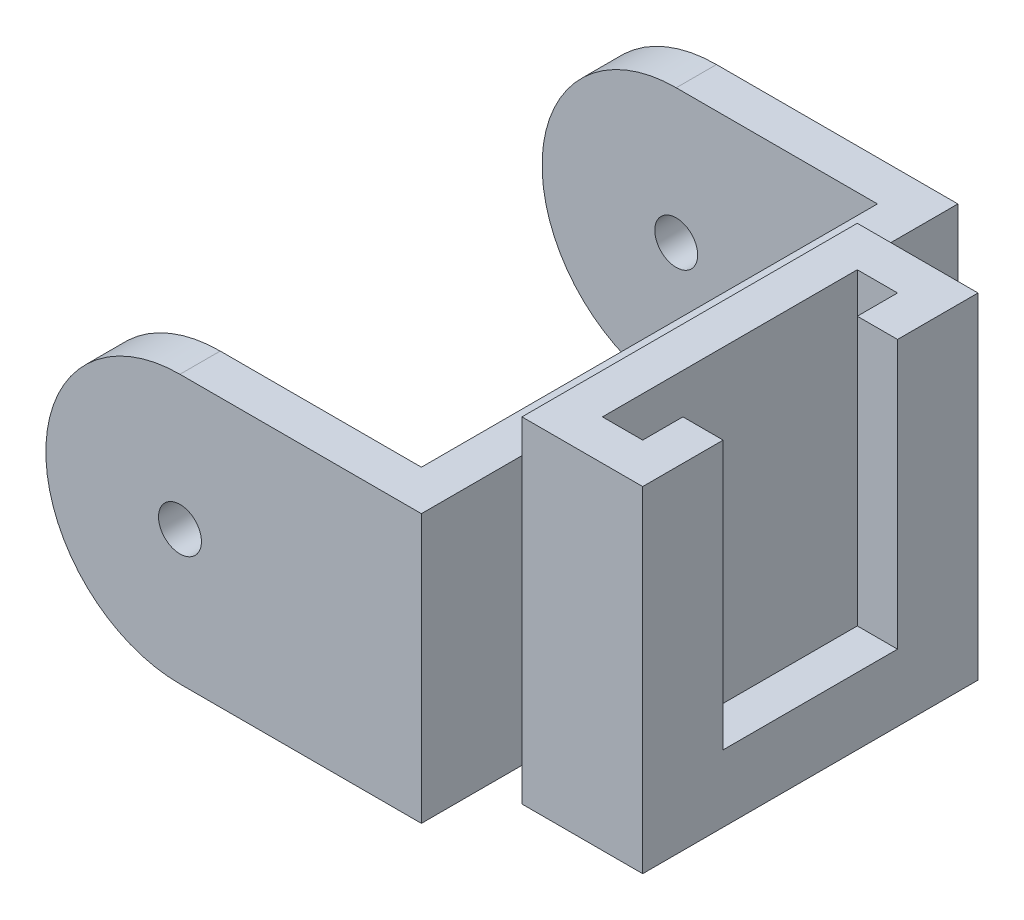
ISO-10303-21;
HEADER;
FILE_DESCRIPTION(('STEP AP214'),'2;1');
FILE_NAME('part.step','',(''),(''),'','','');
FILE_SCHEMA(('AUTOMOTIVE_DESIGN { 1 0 10303 214 1 1 1 1 }'));
ENDSEC;
DATA;
#1=APPLICATION_CONTEXT('core data for automotive mechanical design processes');
#2=APPLICATION_PROTOCOL_DEFINITION('international standard','automotive_design',2000,#1);
#3=PRODUCT_CONTEXT('',#1,'mechanical');
#4=PRODUCT('Part','Part','',(#3));
#5=PRODUCT_RELATED_PRODUCT_CATEGORY('part','',(#4));
#6=PRODUCT_DEFINITION_FORMATION('','',#4);
#7=PRODUCT_DEFINITION_CONTEXT('part definition',#1,'design');
#8=PRODUCT_DEFINITION('design','',#6,#7);
#9=PRODUCT_DEFINITION_SHAPE('','',#8);
#10=(LENGTH_UNIT() NAMED_UNIT(*) SI_UNIT(.MILLI.,.METRE.));
#11=(NAMED_UNIT(*) PLANE_ANGLE_UNIT() SI_UNIT($,.RADIAN.));
#12=(NAMED_UNIT(*) SI_UNIT($,.STERADIAN.) SOLID_ANGLE_UNIT());
#13=UNCERTAINTY_MEASURE_WITH_UNIT(LENGTH_MEASURE(1.E-05),#10,'distance_accuracy_value','');
#14=(GEOMETRIC_REPRESENTATION_CONTEXT(3) GLOBAL_UNCERTAINTY_ASSIGNED_CONTEXT((#13)) GLOBAL_UNIT_ASSIGNED_CONTEXT((#10,
#11,#12)) REPRESENTATION_CONTEXT('',''));
#15=CARTESIAN_POINT('',(0.,0.,0.));
#16=DIRECTION('',(0.,0.,1.));
#17=DIRECTION('',(1.,0.,0.));
#18=AXIS2_PLACEMENT_3D('',#15,#16,#17);
#19=CARTESIAN_POINT('',(3.,0.,0.));
#20=DIRECTION('',(1.,0.,0.));
#21=DIRECTION('',(0.,0.,-1.));
#22=AXIS2_PLACEMENT_3D('',#19,#20,#21);
#23=PLANE('',#22);
#24=DIRECTION('',(0.,1.,0.));
#25=VECTOR('',#24,1.);
#26=CARTESIAN_POINT('',(3.,12.5,-12.5));
#27=LINE('',#26,#25);
#28=CARTESIAN_POINT('',(3.,-10.,-12.5));
#29=VERTEX_POINT('',#28);
#30=CARTESIAN_POINT('',(3.,10.,-12.5));
#31=VERTEX_POINT('',#30);
#32=EDGE_CURVE('E11',#29,#31,#27,.T.);
#33=ORIENTED_EDGE('',*,*,#32,.F.);
#34=DIRECTION('',(0.,0.,-1.));
#35=VECTOR('',#34,1.);
#36=CARTESIAN_POINT('',(3.,-10.,20.));
#37=LINE('',#36,#35);
#38=CARTESIAN_POINT('',(3.,-10.,-20.));
#39=VERTEX_POINT('',#38);
#40=EDGE_CURVE('E368',#29,#39,#37,.T.);
#41=ORIENTED_EDGE('',*,*,#40,.T.);
#42=DIRECTION('',(0.,1.,0.));
#43=VECTOR('',#42,1.);
#44=CARTESIAN_POINT('',(3.,10.,-20.));
#45=LINE('',#44,#43);
#46=CARTESIAN_POINT('',(3.,10.,-20.));
#47=VERTEX_POINT('',#46);
#48=EDGE_CURVE('E354',#39,#47,#45,.T.);
#49=ORIENTED_EDGE('',*,*,#48,.T.);
#50=DIRECTION('',(0.,0.,1.));
#51=VECTOR('',#50,1.);
#52=CARTESIAN_POINT('',(3.,10.,20.));
#53=LINE('',#52,#51);
#54=EDGE_CURVE('E360',#47,#31,#53,.T.);
#55=ORIENTED_EDGE('',*,*,#54,.T.);
#56=EDGE_LOOP('',(#33,#41,#49,#55));
#57=FACE_BOUND('',#56,.T.);
#58=ADVANCED_FACE('F45',(#57),#23,.T.);
#59=CARTESIAN_POINT('',(3.,10.,-20.));
#60=DIRECTION('',(0.,0.,1.));
#61=DIRECTION('',(0.,-1.,0.));
#62=AXIS2_PLACEMENT_3D('',#59,#60,#61);
#63=PLANE('',#62);
#64=CARTESIAN_POINT('',(-15.,0.,-20.));
#65=DIRECTION('',(0.,0.,1.));
#66=DIRECTION('',(0.,-1.,0.));
#67=AXIS2_PLACEMENT_3D('',#64,#65,#66);
#68=CIRCLE('',#67,1.6);
#69=CARTESIAN_POINT('',(-15.,-1.6,-20.));
#70=VERTEX_POINT('',#69);
#71=EDGE_CURVE('E307',#70,#70,#68,.T.);
#72=ORIENTED_EDGE('',*,*,#71,.T.);
#73=EDGE_LOOP('',(#72));
#74=FACE_BOUND('',#73,.T.);
#75=DIRECTION('',(-1.,0.,0.));
#76=VECTOR('',#75,1.);
#77=CARTESIAN_POINT('',(3.,-10.,-20.));
#78=LINE('',#77,#76);
#79=CARTESIAN_POINT('',(-15.,-10.,-20.));
#80=VERTEX_POINT('',#79);
#81=EDGE_CURVE('E372',#39,#80,#78,.T.);
#82=ORIENTED_EDGE('',*,*,#81,.T.);
#83=CARTESIAN_POINT('',(-15.,0.,-20.));
#84=DIRECTION('',(0.,0.,1.));
#85=DIRECTION('',(0.,-1.,0.));
#86=AXIS2_PLACEMENT_3D('',#83,#84,#85);
#87=CIRCLE('',#86,10.);
#88=CARTESIAN_POINT('',(-15.,10.,-20.));
#89=VERTEX_POINT('',#88);
#90=EDGE_CURVE('E330',#89,#80,#87,.T.);
#91=ORIENTED_EDGE('',*,*,#90,.F.);
#92=DIRECTION('',(-1.,0.,0.));
#93=VECTOR('',#92,1.);
#94=CARTESIAN_POINT('',(3.,10.,-20.));
#95=LINE('',#94,#93);
#96=EDGE_CURVE('E390',#47,#89,#95,.T.);
#97=ORIENTED_EDGE('',*,*,#96,.F.);
#98=ORIENTED_EDGE('',*,*,#48,.F.);
#99=EDGE_LOOP('',(#82,#91,#97,#98));
#100=FACE_BOUND('',#99,.T.);
#101=ADVANCED_FACE('F47',(#74,#100),#63,.F.);
#102=CARTESIAN_POINT('',(3.,10.,20.));
#103=DIRECTION('',(0.,0.,-1.));
#104=DIRECTION('',(0.,1.,0.));
#105=AXIS2_PLACEMENT_3D('',#102,#103,#104);
#106=PLANE('',#105);
#107=CARTESIAN_POINT('',(-15.,0.,20.));
#108=DIRECTION('',(0.,0.,1.));
#109=DIRECTION('',(1.,0.,0.));
#110=AXIS2_PLACEMENT_3D('',#107,#108,#109);
#111=CIRCLE('',#110,1.6);
#112=CARTESIAN_POINT('',(-13.4,0.,20.));
#113=VERTEX_POINT('',#112);
#114=EDGE_CURVE('E299',#113,#113,#111,.T.);
#115=ORIENTED_EDGE('',*,*,#114,.F.);
#116=EDGE_LOOP('',(#115));
#117=FACE_BOUND('',#116,.T.);
#118=CARTESIAN_POINT('',(-15.,0.,20.));
#119=DIRECTION('',(0.,0.,1.));
#120=DIRECTION('',(1.,0.,0.));
#121=AXIS2_PLACEMENT_3D('',#118,#119,#120);
#122=CIRCLE('',#121,10.);
#123=CARTESIAN_POINT('',(-15.,10.,20.));
#124=VERTEX_POINT('',#123);
#125=CARTESIAN_POINT('',(-15.,-10.,20.));
#126=VERTEX_POINT('',#125);
#127=EDGE_CURVE('E316',#124,#126,#122,.T.);
#128=ORIENTED_EDGE('',*,*,#127,.T.);
#129=DIRECTION('',(-1.,0.,0.));
#130=VECTOR('',#129,1.);
#131=CARTESIAN_POINT('',(3.,-10.,20.));
#132=LINE('',#131,#130);
#133=CARTESIAN_POINT('',(3.,-10.,20.));
#134=VERTEX_POINT('',#133);
#135=EDGE_CURVE('E383',#134,#126,#132,.T.);
#136=ORIENTED_EDGE('',*,*,#135,.F.);
#137=DIRECTION('',(0.,-1.,0.));
#138=VECTOR('',#137,1.);
#139=CARTESIAN_POINT('',(3.,10.,20.));
#140=LINE('',#139,#138);
#141=CARTESIAN_POINT('',(3.,10.,20.));
#142=VERTEX_POINT('',#141);
#143=EDGE_CURVE('E364',#142,#134,#140,.T.);
#144=ORIENTED_EDGE('',*,*,#143,.F.);
#145=DIRECTION('',(-1.,0.,0.));
#146=VECTOR('',#145,1.);
#147=CARTESIAN_POINT('',(3.,10.,20.));
#148=LINE('',#147,#146);
#149=EDGE_CURVE('E387',#142,#124,#148,.T.);
#150=ORIENTED_EDGE('',*,*,#149,.T.);
#151=EDGE_LOOP('',(#128,#136,#144,#150));
#152=FACE_BOUND('',#151,.T.);
#153=ADVANCED_FACE('F438',(#117,#152),#106,.F.);
#154=CARTESIAN_POINT('',(-25.,10.,-17.));
#155=DIRECTION('',(0.,0.,-1.));
#156=DIRECTION('',(-1.,0.,0.));
#157=AXIS2_PLACEMENT_3D('',#154,#155,#156);
#158=PLANE('',#157);
#159=CARTESIAN_POINT('',(-15.,0.,-17.));
#160=DIRECTION('',(0.,0.,-1.));
#161=DIRECTION('',(-1.,0.,0.));
#162=AXIS2_PLACEMENT_3D('',#159,#160,#161);
#163=CIRCLE('',#162,1.6);
#164=CARTESIAN_POINT('',(-16.6,0.,-17.));
#165=VERTEX_POINT('',#164);
#166=EDGE_CURVE('E303',#165,#165,#163,.T.);
#167=ORIENTED_EDGE('',*,*,#166,.T.);
#168=EDGE_LOOP('',(#167));
#169=FACE_BOUND('',#168,.T.);
#170=CARTESIAN_POINT('',(-15.,0.,-17.));
#171=DIRECTION('',(0.,0.,-1.));
#172=DIRECTION('',(-1.,0.,0.));
#173=AXIS2_PLACEMENT_3D('',#170,#171,#172);
#174=CIRCLE('',#173,10.);
#175=CARTESIAN_POINT('',(-15.,-10.,-17.));
#176=VERTEX_POINT('',#175);
#177=CARTESIAN_POINT('',(-15.,10.,-17.));
#178=VERTEX_POINT('',#177);
#179=EDGE_CURVE('E327',#176,#178,#174,.T.);
#180=ORIENTED_EDGE('',*,*,#179,.F.);
#181=DIRECTION('',(1.,0.,0.));
#182=VECTOR('',#181,1.);
#183=CARTESIAN_POINT('',(-25.,-10.,-17.));
#184=LINE('',#183,#182);
#185=CARTESIAN_POINT('',(0.,-10.,-17.));
#186=VERTEX_POINT('',#185);
#187=EDGE_CURVE('E350',#176,#186,#184,.T.);
#188=ORIENTED_EDGE('',*,*,#187,.T.);
#189=DIRECTION('',(0.,1.,0.));
#190=VECTOR('',#189,1.);
#191=CARTESIAN_POINT('',(0.,10.,-17.));
#192=LINE('',#191,#190);
#193=CARTESIAN_POINT('',(0.,10.,-17.));
#194=VERTEX_POINT('',#193);
#195=EDGE_CURVE('E343',#186,#194,#192,.T.);
#196=ORIENTED_EDGE('',*,*,#195,.T.);
#197=DIRECTION('',(1.,0.,0.));
#198=VECTOR('',#197,1.);
#199=CARTESIAN_POINT('',(-25.,10.,-17.));
#200=LINE('',#199,#198);
#201=EDGE_CURVE('E347',#178,#194,#200,.T.);
#202=ORIENTED_EDGE('',*,*,#201,.F.);
#203=EDGE_LOOP('',(#180,#188,#196,#202));
#204=FACE_BOUND('',#203,.T.);
#205=ADVANCED_FACE('F502',(#169,#204),#158,.F.);
#206=CARTESIAN_POINT('',(-25.,10.,17.));
#207=DIRECTION('',(0.,0.,1.));
#208=DIRECTION('',(0.,-1.,0.));
#209=AXIS2_PLACEMENT_3D('',#206,#207,#208);
#210=PLANE('',#209);
#211=CARTESIAN_POINT('',(-15.,0.,17.));
#212=DIRECTION('',(0.,0.,1.));
#213=DIRECTION('',(0.,-1.,0.));
#214=AXIS2_PLACEMENT_3D('',#211,#212,#213);
#215=CIRCLE('',#214,1.6);
#216=CARTESIAN_POINT('',(-15.,-1.6,17.));
#217=VERTEX_POINT('',#216);
#218=EDGE_CURVE('E49',#217,#217,#215,.T.);
#219=ORIENTED_EDGE('',*,*,#218,.T.);
#220=EDGE_LOOP('',(#219));
#221=FACE_BOUND('',#220,.T.);
#222=DIRECTION('',(1.,0.,0.));
#223=VECTOR('',#222,1.);
#224=CARTESIAN_POINT('',(-25.,-10.,17.));
#225=LINE('',#224,#223);
#226=CARTESIAN_POINT('',(-15.,-10.,17.));
#227=VERTEX_POINT('',#226);
#228=CARTESIAN_POINT('',(0.,-10.,17.));
#229=VERTEX_POINT('',#228);
#230=EDGE_CURVE('E336',#227,#229,#225,.T.);
#231=ORIENTED_EDGE('',*,*,#230,.F.);
#232=CARTESIAN_POINT('',(-15.,0.,17.));
#233=DIRECTION('',(0.,0.,1.));
#234=DIRECTION('',(0.,-1.,0.));
#235=AXIS2_PLACEMENT_3D('',#232,#233,#234);
#236=CIRCLE('',#235,10.);
#237=CARTESIAN_POINT('',(-15.,10.,17.));
#238=VERTEX_POINT('',#237);
#239=EDGE_CURVE('E324',#238,#227,#236,.T.);
#240=ORIENTED_EDGE('',*,*,#239,.F.);
#241=DIRECTION('',(1.,0.,0.));
#242=VECTOR('',#241,1.);
#243=CARTESIAN_POINT('',(-25.,10.,17.));
#244=LINE('',#243,#242);
#245=CARTESIAN_POINT('',(0.,10.,17.));
#246=VERTEX_POINT('',#245);
#247=EDGE_CURVE('E333',#238,#246,#244,.T.);
#248=ORIENTED_EDGE('',*,*,#247,.T.);
#249=DIRECTION('',(0.,-1.,0.));
#250=VECTOR('',#249,1.);
#251=CARTESIAN_POINT('',(0.,10.,17.));
#252=LINE('',#251,#250);
#253=EDGE_CURVE('E339',#246,#229,#252,.T.);
#254=ORIENTED_EDGE('',*,*,#253,.T.);
#255=EDGE_LOOP('',(#231,#240,#248,#254));
#256=FACE_BOUND('',#255,.T.);
#257=ADVANCED_FACE('F464',(#221,#256),#210,.F.);
#258=CARTESIAN_POINT('',(3.,-10.,20.));
#259=DIRECTION('',(0.,1.,0.));
#260=DIRECTION('',(0.,0.,1.));
#261=AXIS2_PLACEMENT_3D('',#258,#259,#260);
#262=PLANE('',#261);
#263=DIRECTION('',(0.,0.,1.));
#264=VECTOR('',#263,1.);
#265=CARTESIAN_POINT('',(-15.,-10.,-28.));
#266=LINE('',#265,#264);
#267=EDGE_CURVE('E315',#80,#176,#266,.T.);
#268=ORIENTED_EDGE('',*,*,#267,.F.);
#269=ORIENTED_EDGE('',*,*,#81,.F.);
#270=ORIENTED_EDGE('',*,*,#40,.F.);
#271=CARTESIAN_POINT('',(3.,-10.,12.5));
#272=VERTEX_POINT('',#271);
#273=EDGE_CURVE('E373',#272,#29,#37,.T.);
#274=ORIENTED_EDGE('',*,*,#273,.F.);
#275=EDGE_CURVE('E369',#134,#272,#37,.T.);
#276=ORIENTED_EDGE('',*,*,#275,.F.);
#277=ORIENTED_EDGE('',*,*,#135,.T.);
#278=EDGE_CURVE('E311',#227,#126,#266,.T.);
#279=ORIENTED_EDGE('',*,*,#278,.F.);
#280=ORIENTED_EDGE('',*,*,#230,.T.);
#281=DIRECTION('',(0.,0.,-1.));
#282=VECTOR('',#281,1.);
#283=CARTESIAN_POINT('',(0.,-10.,20.));
#284=LINE('',#283,#282);
#285=EDGE_CURVE('E359',#229,#186,#284,.T.);
#286=ORIENTED_EDGE('',*,*,#285,.T.);
#287=ORIENTED_EDGE('',*,*,#187,.F.);
#288=EDGE_LOOP('',(#268,#269,#270,#274,#276,#277,#279,#280,#286,#287));
#289=FACE_BOUND('',#288,.T.);
#290=ADVANCED_FACE('F443',(#289),#262,.F.);
#291=CARTESIAN_POINT('',(0.,0.,0.));
#292=DIRECTION('',(1.,0.,0.));
#293=DIRECTION('',(0.,0.,-1.));
#294=AXIS2_PLACEMENT_3D('',#291,#292,#293);
#295=PLANE('',#294);
#296=ORIENTED_EDGE('',*,*,#253,.F.);
#297=DIRECTION('',(0.,0.,1.));
#298=VECTOR('',#297,1.);
#299=CARTESIAN_POINT('',(0.,10.,20.));
#300=LINE('',#299,#298);
#301=EDGE_CURVE('E353',#194,#246,#300,.T.);
#302=ORIENTED_EDGE('',*,*,#301,.F.);
#303=ORIENTED_EDGE('',*,*,#195,.F.);
#304=ORIENTED_EDGE('',*,*,#285,.F.);
#305=EDGE_LOOP('',(#296,#302,#303,#304));
#306=FACE_BOUND('',#305,.T.);
#307=ADVANCED_FACE('F494',(#306),#295,.F.);
#308=CARTESIAN_POINT('',(3.,10.,20.));
#309=DIRECTION('',(0.,-1.,0.));
#310=DIRECTION('',(0.,0.,-1.));
#311=AXIS2_PLACEMENT_3D('',#308,#309,#310);
#312=PLANE('',#311);
#313=ORIENTED_EDGE('',*,*,#96,.T.);
#314=DIRECTION('',(0.,0.,1.));
#315=VECTOR('',#314,1.);
#316=CARTESIAN_POINT('',(-15.,10.,-28.));
#317=LINE('',#316,#315);
#318=EDGE_CURVE('E323',#89,#178,#317,.T.);
#319=ORIENTED_EDGE('',*,*,#318,.T.);
#320=ORIENTED_EDGE('',*,*,#201,.T.);
#321=ORIENTED_EDGE('',*,*,#301,.T.);
#322=ORIENTED_EDGE('',*,*,#247,.F.);
#323=EDGE_CURVE('E319',#238,#124,#317,.T.);
#324=ORIENTED_EDGE('',*,*,#323,.T.);
#325=ORIENTED_EDGE('',*,*,#149,.F.);
#326=CARTESIAN_POINT('',(3.,10.,12.5));
#327=VERTEX_POINT('',#326);
#328=EDGE_CURVE('E358',#327,#142,#53,.T.);
#329=ORIENTED_EDGE('',*,*,#328,.F.);
#330=EDGE_CURVE('E365',#31,#327,#53,.T.);
#331=ORIENTED_EDGE('',*,*,#330,.F.);
#332=ORIENTED_EDGE('',*,*,#54,.F.);
#333=EDGE_LOOP('',(#313,#319,#320,#321,#322,#324,#325,#329,#331,#332));
#334=FACE_BOUND('',#333,.T.);
#335=ADVANCED_FACE('F435',(#334),#312,.F.);
#336=DIRECTION('',(0.,-1.,0.));
#337=VECTOR('',#336,1.);
#338=CARTESIAN_POINT('',(3.,12.5,12.5));
#339=LINE('',#338,#337);
#340=EDGE_CURVE('E55',#327,#272,#339,.T.);
#341=ORIENTED_EDGE('',*,*,#340,.F.);
#342=ORIENTED_EDGE('',*,*,#328,.T.);
#343=ORIENTED_EDGE('',*,*,#143,.T.);
#344=ORIENTED_EDGE('',*,*,#275,.T.);
#345=EDGE_LOOP('',(#341,#342,#343,#344));
#346=FACE_BOUND('',#345,.T.);
#347=ADVANCED_FACE('F432',(#346),#23,.T.);
#348=CARTESIAN_POINT('',(-15.,0.,-28.));
#349=DIRECTION('',(0.,0.,1.));
#350=DIRECTION('',(1.,0.,0.));
#351=AXIS2_PLACEMENT_3D('',#348,#349,#350);
#352=CYLINDRICAL_SURFACE('',#351,10.);
#353=ORIENTED_EDGE('',*,*,#239,.T.);
#354=ORIENTED_EDGE('',*,*,#278,.T.);
#355=ORIENTED_EDGE('',*,*,#127,.F.);
#356=ORIENTED_EDGE('',*,*,#323,.F.);
#357=EDGE_LOOP('',(#353,#354,#355,#356));
#358=FACE_BOUND('',#357,.T.);
#359=ADVANCED_FACE('F477',(#358),#352,.T.);
#360=ORIENTED_EDGE('',*,*,#90,.T.);
#361=ORIENTED_EDGE('',*,*,#267,.T.);
#362=ORIENTED_EDGE('',*,*,#179,.T.);
#363=ORIENTED_EDGE('',*,*,#318,.F.);
#364=EDGE_LOOP('',(#360,#361,#362,#363));
#365=FACE_BOUND('',#364,.T.);
#366=ADVANCED_FACE('F455',(#365),#352,.T.);
#367=CARTESIAN_POINT('',(-15.,0.,-28.));
#368=DIRECTION('',(0.,0.,1.));
#369=DIRECTION('',(1.,0.,0.));
#370=AXIS2_PLACEMENT_3D('',#367,#368,#369);
#371=CYLINDRICAL_SURFACE('',#370,1.6);
#372=ORIENTED_EDGE('',*,*,#114,.T.);
#373=EDGE_LOOP('',(#372));
#374=FACE_BOUND('',#373,.T.);
#375=ORIENTED_EDGE('',*,*,#218,.F.);
#376=EDGE_LOOP('',(#375));
#377=FACE_BOUND('',#376,.T.);
#378=ADVANCED_FACE('F467',(#374,#377),#371,.F.);
#379=ORIENTED_EDGE('',*,*,#166,.F.);
#380=EDGE_LOOP('',(#379));
#381=FACE_BOUND('',#380,.T.);
#382=ORIENTED_EDGE('',*,*,#71,.F.);
#383=EDGE_LOOP('',(#382));
#384=FACE_BOUND('',#383,.T.);
#385=ADVANCED_FACE('F469',(#381,#384),#371,.F.);
#386=CARTESIAN_POINT('',(3.,0.,0.));
#387=DIRECTION('',(1.,0.,0.));
#388=DIRECTION('',(0.,0.,-1.));
#389=AXIS2_PLACEMENT_3D('',#386,#387,#388);
#390=PLANE('',#389);
#391=CARTESIAN_POINT('',(3.,12.5,-12.5));
#392=VERTEX_POINT('',#391);
#393=EDGE_CURVE('E58',#31,#392,#27,.T.);
#394=ORIENTED_EDGE('',*,*,#393,.F.);
#395=ORIENTED_EDGE('',*,*,#330,.T.);
#396=CARTESIAN_POINT('',(3.,12.5,12.5));
#397=VERTEX_POINT('',#396);
#398=EDGE_CURVE('E278',#397,#327,#339,.T.);
#399=ORIENTED_EDGE('',*,*,#398,.F.);
#400=DIRECTION('',(0.,0.,1.));
#401=VECTOR('',#400,1.);
#402=CARTESIAN_POINT('',(3.,12.5,12.5));
#403=LINE('',#402,#401);
#404=EDGE_CURVE('E274',#392,#397,#403,.T.);
#405=ORIENTED_EDGE('',*,*,#404,.F.);
#406=EDGE_LOOP('',(#394,#395,#399,#405));
#407=FACE_BOUND('',#406,.T.);
#408=ADVANCED_FACE('F426',(#407),#390,.F.);
#409=CARTESIAN_POINT('',(3.,-12.5,12.5));
#410=VERTEX_POINT('',#409);
#411=EDGE_CURVE('E277',#272,#410,#339,.T.);
#412=ORIENTED_EDGE('',*,*,#411,.F.);
#413=ORIENTED_EDGE('',*,*,#273,.T.);
#414=CARTESIAN_POINT('',(3.,-12.5,-12.5));
#415=VERTEX_POINT('',#414);
#416=EDGE_CURVE('E57',#415,#29,#27,.T.);
#417=ORIENTED_EDGE('',*,*,#416,.F.);
#418=DIRECTION('',(0.,0.,-1.));
#419=VECTOR('',#418,1.);
#420=CARTESIAN_POINT('',(3.,-12.5,12.5));
#421=LINE('',#420,#419);
#422=EDGE_CURVE('E260',#410,#415,#421,.T.);
#423=ORIENTED_EDGE('',*,*,#422,.F.);
#424=EDGE_LOOP('',(#412,#413,#417,#423));
#425=FACE_BOUND('',#424,.T.);
#426=ADVANCED_FACE('F412',(#425),#390,.F.);
#427=CARTESIAN_POINT('',(12.,12.5,-12.5));
#428=DIRECTION('',(0.,0.,1.));
#429=DIRECTION('',(0.,-1.,0.));
#430=AXIS2_PLACEMENT_3D('',#427,#428,#429);
#431=PLANE('',#430);
#432=ORIENTED_EDGE('',*,*,#416,.T.);
#433=ORIENTED_EDGE('',*,*,#32,.T.);
#434=ORIENTED_EDGE('',*,*,#393,.T.);
#435=DIRECTION('',(-1.,0.,0.));
#436=VECTOR('',#435,1.);
#437=CARTESIAN_POINT('',(12.,12.5,-12.5));
#438=LINE('',#437,#436);
#439=CARTESIAN_POINT('',(12.,12.5,-12.5));
#440=VERTEX_POINT('',#439);
#441=EDGE_CURVE('E295',#440,#392,#438,.T.);
#442=ORIENTED_EDGE('',*,*,#441,.F.);
#443=DIRECTION('',(0.,1.,0.));
#444=VECTOR('',#443,1.);
#445=CARTESIAN_POINT('',(12.,12.5,-12.5));
#446=LINE('',#445,#444);
#447=CARTESIAN_POINT('',(12.,-12.5,-12.5));
#448=VERTEX_POINT('',#447);
#449=EDGE_CURVE('E256',#448,#440,#446,.T.);
#450=ORIENTED_EDGE('',*,*,#449,.F.);
#451=DIRECTION('',(-1.,0.,0.));
#452=VECTOR('',#451,1.);
#453=CARTESIAN_POINT('',(12.,-12.5,-12.5));
#454=LINE('',#453,#452);
#455=EDGE_CURVE('E270',#448,#415,#454,.T.);
#456=ORIENTED_EDGE('',*,*,#455,.T.);
#457=EDGE_LOOP('',(#432,#433,#434,#442,#450,#456));
#458=FACE_BOUND('',#457,.T.);
#459=ADVANCED_FACE('F415',(#458),#431,.F.);
#460=CARTESIAN_POINT('',(12.,12.5,12.5));
#461=DIRECTION('',(0.,-1.,0.));
#462=DIRECTION('',(0.,0.,-1.));
#463=AXIS2_PLACEMENT_3D('',#460,#461,#462);
#464=PLANE('',#463);
#465=DIRECTION('',(0.,0.,-1.));
#466=VECTOR('',#465,1.);
#467=CARTESIAN_POINT('',(9.,12.5,9.5));
#468=LINE('',#467,#466);
#469=CARTESIAN_POINT('',(9.,12.5,-6.49999999999999));
#470=VERTEX_POINT('',#469);
#471=CARTESIAN_POINT('',(9.,12.5,-9.5));
#472=VERTEX_POINT('',#471);
#473=EDGE_CURVE('E73',#470,#472,#468,.T.);
#474=ORIENTED_EDGE('',*,*,#473,.F.);
#475=DIRECTION('',(1.,0.,0.));
#476=VECTOR('',#475,1.);
#477=CARTESIAN_POINT('',(9.,12.5,-6.49999999999999));
#478=LINE('',#477,#476);
#479=CARTESIAN_POINT('',(12.,12.5,-6.49999999999999));
#480=VERTEX_POINT('',#479);
#481=EDGE_CURVE('E233',#470,#480,#478,.T.);
#482=ORIENTED_EDGE('',*,*,#481,.T.);
#483=DIRECTION('',(0.,0.,1.));
#484=VECTOR('',#483,1.);
#485=CARTESIAN_POINT('',(12.,12.5,12.5));
#486=LINE('',#485,#484);
#487=EDGE_CURVE('E261',#440,#480,#486,.T.);
#488=ORIENTED_EDGE('',*,*,#487,.F.);
#489=ORIENTED_EDGE('',*,*,#441,.T.);
#490=ORIENTED_EDGE('',*,*,#404,.T.);
#491=DIRECTION('',(-1.,0.,0.));
#492=VECTOR('',#491,1.);
#493=CARTESIAN_POINT('',(12.,12.5,12.5));
#494=LINE('',#493,#492);
#495=CARTESIAN_POINT('',(12.,12.5,12.5));
#496=VERTEX_POINT('',#495);
#497=EDGE_CURVE('E291',#496,#397,#494,.T.);
#498=ORIENTED_EDGE('',*,*,#497,.F.);
#499=CARTESIAN_POINT('',(12.,12.5,6.50000000000001));
#500=VERTEX_POINT('',#499);
#501=EDGE_CURVE('E217',#500,#496,#486,.T.);
#502=ORIENTED_EDGE('',*,*,#501,.F.);
#503=DIRECTION('',(1.,0.,0.));
#504=VECTOR('',#503,1.);
#505=CARTESIAN_POINT('',(9.,12.5,6.50000000000001));
#506=LINE('',#505,#504);
#507=CARTESIAN_POINT('',(9.,12.5,6.50000000000001));
#508=VERTEX_POINT('',#507);
#509=EDGE_CURVE('E203',#508,#500,#506,.T.);
#510=ORIENTED_EDGE('',*,*,#509,.F.);
#511=CARTESIAN_POINT('',(9.,12.5,9.5));
#512=VERTEX_POINT('',#511);
#513=EDGE_CURVE('E215',#512,#508,#468,.T.);
#514=ORIENTED_EDGE('',*,*,#513,.F.);
#515=DIRECTION('',(1.,0.,0.));
#516=VECTOR('',#515,1.);
#517=CARTESIAN_POINT('',(6.,12.5,9.5));
#518=LINE('',#517,#516);
#519=CARTESIAN_POINT('',(6.,12.5,9.5));
#520=VERTEX_POINT('',#519);
#521=EDGE_CURVE('E241',#520,#512,#518,.T.);
#522=ORIENTED_EDGE('',*,*,#521,.F.);
#523=DIRECTION('',(0.,0.,1.));
#524=VECTOR('',#523,1.);
#525=CARTESIAN_POINT('',(6.,12.5,-9.5));
#526=LINE('',#525,#524);
#527=CARTESIAN_POINT('',(6.,12.5,-9.5));
#528=VERTEX_POINT('',#527);
#529=EDGE_CURVE('E231',#528,#520,#526,.T.);
#530=ORIENTED_EDGE('',*,*,#529,.F.);
#531=DIRECTION('',(-1.,0.,0.));
#532=VECTOR('',#531,1.);
#533=CARTESIAN_POINT('',(9.,12.5,-9.5));
#534=LINE('',#533,#532);
#535=EDGE_CURVE('E226',#472,#528,#534,.T.);
#536=ORIENTED_EDGE('',*,*,#535,.F.);
#537=EDGE_LOOP('',(#474,#482,#488,#489,#490,#498,#502,#510,#514,#522,#530,#536));
#538=FACE_BOUND('',#537,.T.);
#539=ADVANCED_FACE('F213',(#538),#464,.F.);
#540=CARTESIAN_POINT('',(12.,12.5,12.5));
#541=DIRECTION('',(0.,0.,-1.));
#542=DIRECTION('',(0.,1.,0.));
#543=AXIS2_PLACEMENT_3D('',#540,#541,#542);
#544=PLANE('',#543);
#545=ORIENTED_EDGE('',*,*,#398,.T.);
#546=ORIENTED_EDGE('',*,*,#340,.T.);
#547=ORIENTED_EDGE('',*,*,#411,.T.);
#548=DIRECTION('',(-1.,0.,0.));
#549=VECTOR('',#548,1.);
#550=CARTESIAN_POINT('',(12.,-12.5,12.5));
#551=LINE('',#550,#549);
#552=CARTESIAN_POINT('',(12.,-12.5,12.5));
#553=VERTEX_POINT('',#552);
#554=EDGE_CURVE('E287',#553,#410,#551,.T.);
#555=ORIENTED_EDGE('',*,*,#554,.F.);
#556=DIRECTION('',(0.,-1.,0.));
#557=VECTOR('',#556,1.);
#558=CARTESIAN_POINT('',(12.,12.5,12.5));
#559=LINE('',#558,#557);
#560=EDGE_CURVE('E265',#496,#553,#559,.T.);
#561=ORIENTED_EDGE('',*,*,#560,.F.);
#562=ORIENTED_EDGE('',*,*,#497,.T.);
#563=EDGE_LOOP('',(#545,#546,#547,#555,#561,#562));
#564=FACE_BOUND('',#563,.T.);
#565=ADVANCED_FACE('F402',(#564),#544,.F.);
#566=CARTESIAN_POINT('',(12.,-12.5,12.5));
#567=DIRECTION('',(0.,1.,0.));
#568=DIRECTION('',(0.,0.,1.));
#569=AXIS2_PLACEMENT_3D('',#566,#567,#568);
#570=PLANE('',#569);
#571=ORIENTED_EDGE('',*,*,#422,.T.);
#572=ORIENTED_EDGE('',*,*,#455,.F.);
#573=DIRECTION('',(0.,0.,-1.));
#574=VECTOR('',#573,1.);
#575=CARTESIAN_POINT('',(12.,-12.5,12.5));
#576=LINE('',#575,#574);
#577=EDGE_CURVE('E268',#553,#448,#576,.T.);
#578=ORIENTED_EDGE('',*,*,#577,.F.);
#579=ORIENTED_EDGE('',*,*,#554,.T.);
#580=EDGE_LOOP('',(#571,#572,#578,#579));
#581=FACE_BOUND('',#580,.T.);
#582=ADVANCED_FACE('F409',(#581),#570,.F.);
#583=CARTESIAN_POINT('',(12.,0.,0.));
#584=DIRECTION('',(1.,0.,0.));
#585=DIRECTION('',(0.,0.,-1.));
#586=AXIS2_PLACEMENT_3D('',#583,#584,#585);
#587=PLANE('',#586);
#588=DIRECTION('',(0.,1.,0.));
#589=VECTOR('',#588,1.);
#590=CARTESIAN_POINT('',(12.,12.5,-6.49999999999999));
#591=LINE('',#590,#589);
#592=CARTESIAN_POINT('',(12.,-7.5,-6.5));
#593=VERTEX_POINT('',#592);
#594=EDGE_CURVE('E208',#593,#480,#591,.T.);
#595=ORIENTED_EDGE('',*,*,#594,.F.);
#596=DIRECTION('',(0.,0.,-1.));
#597=VECTOR('',#596,1.);
#598=CARTESIAN_POINT('',(12.,-7.5,6.5));
#599=LINE('',#598,#597);
#600=CARTESIAN_POINT('',(12.,-7.5,6.5));
#601=VERTEX_POINT('',#600);
#602=EDGE_CURVE('E856',#601,#593,#599,.T.);
#603=ORIENTED_EDGE('',*,*,#602,.F.);
#604=DIRECTION('',(0.,-1.,0.));
#605=VECTOR('',#604,1.);
#606=CARTESIAN_POINT('',(12.,12.5,6.50000000000001));
#607=LINE('',#606,#605);
#608=EDGE_CURVE('E860',#500,#601,#607,.T.);
#609=ORIENTED_EDGE('',*,*,#608,.F.);
#610=ORIENTED_EDGE('',*,*,#501,.T.);
#611=ORIENTED_EDGE('',*,*,#560,.T.);
#612=ORIENTED_EDGE('',*,*,#577,.T.);
#613=ORIENTED_EDGE('',*,*,#449,.T.);
#614=ORIENTED_EDGE('',*,*,#487,.T.);
#615=EDGE_LOOP('',(#595,#603,#609,#610,#611,#612,#613,#614));
#616=FACE_BOUND('',#615,.T.);
#617=ADVANCED_FACE('F420',(#616),#587,.T.);
#618=CARTESIAN_POINT('',(9.,-10.5,9.5));
#619=DIRECTION('',(1.,0.,0.));
#620=DIRECTION('',(0.,0.,-1.));
#621=AXIS2_PLACEMENT_3D('',#618,#619,#620);
#622=PLANE('',#621);
#623=DIRECTION('',(0.,0.,-1.));
#624=VECTOR('',#623,1.);
#625=CARTESIAN_POINT('',(9.,-7.5,6.5));
#626=LINE('',#625,#624);
#627=CARTESIAN_POINT('',(9.,-7.5,6.5));
#628=VERTEX_POINT('',#627);
#629=CARTESIAN_POINT('',(9.,-7.5,-6.5));
#630=VERTEX_POINT('',#629);
#631=EDGE_CURVE('E65',#628,#630,#626,.T.);
#632=ORIENTED_EDGE('',*,*,#631,.T.);
#633=DIRECTION('',(0.,1.,0.));
#634=VECTOR('',#633,1.);
#635=CARTESIAN_POINT('',(9.,12.5,-6.49999999999999));
#636=LINE('',#635,#634);
#637=EDGE_CURVE('E219',#630,#470,#636,.T.);
#638=ORIENTED_EDGE('',*,*,#637,.T.);
#639=ORIENTED_EDGE('',*,*,#473,.T.);
#640=DIRECTION('',(0.,1.,0.));
#641=VECTOR('',#640,1.);
#642=CARTESIAN_POINT('',(9.,-10.5,-9.5));
#643=LINE('',#642,#641);
#644=CARTESIAN_POINT('',(9.,-10.5,-9.5));
#645=VERTEX_POINT('',#644);
#646=EDGE_CURVE('E253',#645,#472,#643,.T.);
#647=ORIENTED_EDGE('',*,*,#646,.F.);
#648=DIRECTION('',(0.,0.,-1.));
#649=VECTOR('',#648,1.);
#650=CARTESIAN_POINT('',(9.,-10.5,9.5));
#651=LINE('',#650,#649);
#652=CARTESIAN_POINT('',(9.,-10.5,9.5));
#653=VERTEX_POINT('',#652);
#654=EDGE_CURVE('E244',#653,#645,#651,.T.);
#655=ORIENTED_EDGE('',*,*,#654,.F.);
#656=DIRECTION('',(0.,1.,0.));
#657=VECTOR('',#656,1.);
#658=CARTESIAN_POINT('',(9.,-10.5,9.5));
#659=LINE('',#658,#657);
#660=EDGE_CURVE('E223',#653,#512,#659,.T.);
#661=ORIENTED_EDGE('',*,*,#660,.T.);
#662=ORIENTED_EDGE('',*,*,#513,.T.);
#663=DIRECTION('',(0.,-1.,0.));
#664=VECTOR('',#663,1.);
#665=CARTESIAN_POINT('',(9.,12.5,6.50000000000001));
#666=LINE('',#665,#664);
#667=EDGE_CURVE('E199',#508,#628,#666,.T.);
#668=ORIENTED_EDGE('',*,*,#667,.T.);
#669=EDGE_LOOP('',(#632,#638,#639,#647,#655,#661,#662,#668));
#670=FACE_BOUND('',#669,.T.);
#671=ADVANCED_FACE('F221',(#670),#622,.F.);
#672=CARTESIAN_POINT('',(6.,-10.5,9.5));
#673=DIRECTION('',(0.,0.,1.));
#674=DIRECTION('',(1.,0.,0.));
#675=AXIS2_PLACEMENT_3D('',#672,#673,#674);
#676=PLANE('',#675);
#677=ORIENTED_EDGE('',*,*,#521,.T.);
#678=ORIENTED_EDGE('',*,*,#660,.F.);
#679=DIRECTION('',(1.,0.,0.));
#680=VECTOR('',#679,1.);
#681=CARTESIAN_POINT('',(6.,-10.5,9.5));
#682=LINE('',#681,#680);
#683=CARTESIAN_POINT('',(6.,-10.5,9.5));
#684=VERTEX_POINT('',#683);
#685=EDGE_CURVE('E235',#684,#653,#682,.T.);
#686=ORIENTED_EDGE('',*,*,#685,.F.);
#687=DIRECTION('',(0.,1.,0.));
#688=VECTOR('',#687,1.);
#689=CARTESIAN_POINT('',(6.,-10.5,9.5));
#690=LINE('',#689,#688);
#691=EDGE_CURVE('E247',#684,#520,#690,.T.);
#692=ORIENTED_EDGE('',*,*,#691,.T.);
#693=EDGE_LOOP('',(#677,#678,#686,#692));
#694=FACE_BOUND('',#693,.T.);
#695=ADVANCED_FACE('F630',(#694),#676,.F.);
#696=CARTESIAN_POINT('',(6.,-10.5,-9.5));
#697=DIRECTION('',(-1.,0.,0.));
#698=DIRECTION('',(0.,0.,1.));
#699=AXIS2_PLACEMENT_3D('',#696,#697,#698);
#700=PLANE('',#699);
#701=ORIENTED_EDGE('',*,*,#529,.T.);
#702=ORIENTED_EDGE('',*,*,#691,.F.);
#703=DIRECTION('',(0.,0.,1.));
#704=VECTOR('',#703,1.);
#705=CARTESIAN_POINT('',(6.,-10.5,-9.5));
#706=LINE('',#705,#704);
#707=CARTESIAN_POINT('',(6.,-10.5,-9.5));
#708=VERTEX_POINT('',#707);
#709=EDGE_CURVE('E879',#708,#684,#706,.T.);
#710=ORIENTED_EDGE('',*,*,#709,.F.);
#711=DIRECTION('',(0.,1.,0.));
#712=VECTOR('',#711,1.);
#713=CARTESIAN_POINT('',(6.,-10.5,-9.5));
#714=LINE('',#713,#712);
#715=EDGE_CURVE('E250',#708,#528,#714,.T.);
#716=ORIENTED_EDGE('',*,*,#715,.T.);
#717=EDGE_LOOP('',(#701,#702,#710,#716));
#718=FACE_BOUND('',#717,.T.);
#719=ADVANCED_FACE('F636',(#718),#700,.F.);
#720=CARTESIAN_POINT('',(9.,-10.5,-9.5));
#721=DIRECTION('',(0.,0.,-1.));
#722=DIRECTION('',(-1.,0.,0.));
#723=AXIS2_PLACEMENT_3D('',#720,#721,#722);
#724=PLANE('',#723);
#725=ORIENTED_EDGE('',*,*,#535,.T.);
#726=ORIENTED_EDGE('',*,*,#715,.F.);
#727=DIRECTION('',(-1.,0.,0.));
#728=VECTOR('',#727,1.);
#729=CARTESIAN_POINT('',(9.,-10.5,-9.5));
#730=LINE('',#729,#728);
#731=EDGE_CURVE('E876',#645,#708,#730,.T.);
#732=ORIENTED_EDGE('',*,*,#731,.F.);
#733=ORIENTED_EDGE('',*,*,#646,.T.);
#734=EDGE_LOOP('',(#725,#726,#732,#733));
#735=FACE_BOUND('',#734,.T.);
#736=ADVANCED_FACE('F650',(#735),#724,.F.);
#737=CARTESIAN_POINT('',(0.,-10.5,0.));
#738=DIRECTION('',(0.,1.,0.));
#739=DIRECTION('',(0.,0.,1.));
#740=AXIS2_PLACEMENT_3D('',#737,#738,#739);
#741=PLANE('',#740);
#742=ORIENTED_EDGE('',*,*,#654,.T.);
#743=ORIENTED_EDGE('',*,*,#731,.T.);
#744=ORIENTED_EDGE('',*,*,#709,.T.);
#745=ORIENTED_EDGE('',*,*,#685,.T.);
#746=EDGE_LOOP('',(#742,#743,#744,#745));
#747=FACE_BOUND('',#746,.T.);
#748=ADVANCED_FACE('F662',(#747),#741,.T.);
#749=CARTESIAN_POINT('',(9.,12.5,-6.49999999999999));
#750=DIRECTION('',(0.,0.,-1.));
#751=DIRECTION('',(0.,1.,0.));
#752=AXIS2_PLACEMENT_3D('',#749,#750,#751);
#753=PLANE('',#752);
#754=ORIENTED_EDGE('',*,*,#594,.T.);
#755=ORIENTED_EDGE('',*,*,#481,.F.);
#756=ORIENTED_EDGE('',*,*,#637,.F.);
#757=DIRECTION('',(1.,0.,0.));
#758=VECTOR('',#757,1.);
#759=CARTESIAN_POINT('',(9.,-7.5,-6.5));
#760=LINE('',#759,#758);
#761=EDGE_CURVE('E857',#630,#593,#760,.T.);
#762=ORIENTED_EDGE('',*,*,#761,.T.);
#763=EDGE_LOOP('',(#754,#755,#756,#762));
#764=FACE_BOUND('',#763,.T.);
#765=ADVANCED_FACE('F674',(#764),#753,.F.);
#766=CARTESIAN_POINT('',(9.,-7.5,6.5));
#767=DIRECTION('',(0.,-1.,0.));
#768=DIRECTION('',(0.,0.,-1.));
#769=AXIS2_PLACEMENT_3D('',#766,#767,#768);
#770=PLANE('',#769);
#771=ORIENTED_EDGE('',*,*,#602,.T.);
#772=ORIENTED_EDGE('',*,*,#761,.F.);
#773=ORIENTED_EDGE('',*,*,#631,.F.);
#774=DIRECTION('',(1.,0.,0.));
#775=VECTOR('',#774,1.);
#776=CARTESIAN_POINT('',(9.,-7.5,6.5));
#777=LINE('',#776,#775);
#778=EDGE_CURVE('E205',#628,#601,#777,.T.);
#779=ORIENTED_EDGE('',*,*,#778,.T.);
#780=EDGE_LOOP('',(#771,#772,#773,#779));
#781=FACE_BOUND('',#780,.T.);
#782=ADVANCED_FACE('F710',(#781),#770,.F.);
#783=CARTESIAN_POINT('',(9.,12.5,6.50000000000001));
#784=DIRECTION('',(0.,0.,1.));
#785=DIRECTION('',(0.,-1.,0.));
#786=AXIS2_PLACEMENT_3D('',#783,#784,#785);
#787=PLANE('',#786);
#788=ORIENTED_EDGE('',*,*,#608,.T.);
#789=ORIENTED_EDGE('',*,*,#778,.F.);
#790=ORIENTED_EDGE('',*,*,#667,.F.);
#791=ORIENTED_EDGE('',*,*,#509,.T.);
#792=EDGE_LOOP('',(#788,#789,#790,#791));
#793=FACE_BOUND('',#792,.T.);
#794=ADVANCED_FACE('F202',(#793),#787,.F.);
#795=CLOSED_SHELL('',(#58,#101,#153,#205,#257,#290,#307,#335,#347,#359,#366,#378,#385,#408,#426,
#459,#539,#565,#582,#617,#671,#695,#719,#736,#748,#765,#782,#794));
#796=MANIFOLD_SOLID_BREP('B2',#795);
#797=ADVANCED_BREP_SHAPE_REPRESENTATION('',(#18,#796),#14);
#798=SHAPE_DEFINITION_REPRESENTATION(#9,#797);
ENDSEC;
END-ISO-10303-21;
